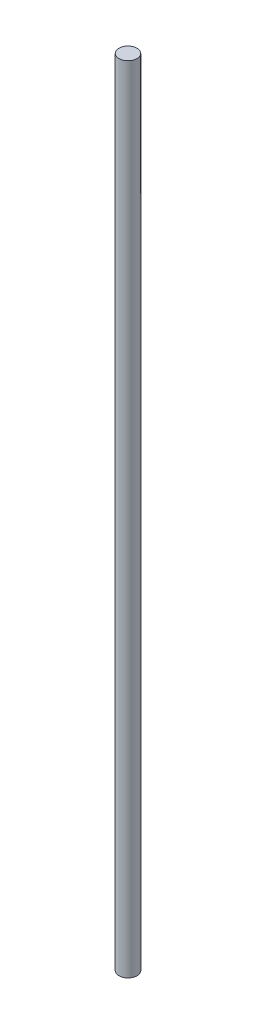
ISO-10303-21;
HEADER;
FILE_DESCRIPTION(('STEP AP214'),'2;1');
FILE_NAME('part.step','',(''),(''),'','','');
FILE_SCHEMA(('AUTOMOTIVE_DESIGN { 1 0 10303 214 1 1 1 1 }'));
ENDSEC;
DATA;
#1=APPLICATION_CONTEXT('core data for automotive mechanical design processes');
#2=APPLICATION_PROTOCOL_DEFINITION('international standard','automotive_design',2000,#1);
#3=PRODUCT_CONTEXT('',#1,'mechanical');
#4=PRODUCT('Part','Part','',(#3));
#5=PRODUCT_RELATED_PRODUCT_CATEGORY('part','',(#4));
#6=PRODUCT_DEFINITION_FORMATION('','',#4);
#7=PRODUCT_DEFINITION_CONTEXT('part definition',#1,'design');
#8=PRODUCT_DEFINITION('design','',#6,#7);
#9=PRODUCT_DEFINITION_SHAPE('','',#8);
#10=(LENGTH_UNIT() NAMED_UNIT(*) SI_UNIT(.MILLI.,.METRE.));
#11=(NAMED_UNIT(*) PLANE_ANGLE_UNIT() SI_UNIT($,.RADIAN.));
#12=(NAMED_UNIT(*) SI_UNIT($,.STERADIAN.) SOLID_ANGLE_UNIT());
#13=UNCERTAINTY_MEASURE_WITH_UNIT(LENGTH_MEASURE(1.E-05),#10,'distance_accuracy_value','');
#14=(GEOMETRIC_REPRESENTATION_CONTEXT(3) GLOBAL_UNCERTAINTY_ASSIGNED_CONTEXT((#13)) GLOBAL_UNIT_ASSIGNED_CONTEXT((#10,
#11,#12)) REPRESENTATION_CONTEXT('',''));
#15=CARTESIAN_POINT('',(0.,0.,0.));
#16=DIRECTION('',(0.,0.,1.));
#17=DIRECTION('',(1.,0.,0.));
#18=AXIS2_PLACEMENT_3D('',#15,#16,#17);
#19=CARTESIAN_POINT('',(0.,220.,0.));
#20=DIRECTION('',(0.,-1.,0.));
#21=DIRECTION('',(0.,0.,-1.));
#22=AXIS2_PLACEMENT_3D('',#19,#20,#21);
#23=CYLINDRICAL_SURFACE('',#22,2.5);
#24=CARTESIAN_POINT('',(0.,220.,0.));
#25=DIRECTION('',(0.,1.,0.));
#26=DIRECTION('',(0.,0.,1.));
#27=AXIS2_PLACEMENT_3D('',#24,#25,#26);
#28=CIRCLE('',#27,2.5);
#29=CARTESIAN_POINT('',(0.,220.,2.5));
#30=VERTEX_POINT('',#29);
#31=EDGE_CURVE('E10',#30,#30,#28,.T.);
#32=ORIENTED_EDGE('',*,*,#31,.F.);
#33=EDGE_LOOP('',(#32));
#34=FACE_BOUND('',#33,.T.);
#35=CARTESIAN_POINT('',(0.,0.,0.));
#36=DIRECTION('',(0.,1.,0.));
#37=DIRECTION('',(0.,0.,1.));
#38=AXIS2_PLACEMENT_3D('',#35,#36,#37);
#39=CIRCLE('',#38,2.5);
#40=CARTESIAN_POINT('',(0.,0.,2.5));
#41=VERTEX_POINT('',#40);
#42=EDGE_CURVE('E38',#41,#41,#39,.T.);
#43=ORIENTED_EDGE('',*,*,#42,.T.);
#44=EDGE_LOOP('',(#43));
#45=FACE_BOUND('',#44,.T.);
#46=ADVANCED_FACE('F35',(#34,#45),#23,.T.);
#47=CARTESIAN_POINT('',(0.,220.,0.));
#48=DIRECTION('',(0.,1.,0.));
#49=DIRECTION('',(0.,0.,1.));
#50=AXIS2_PLACEMENT_3D('',#47,#48,#49);
#51=PLANE('',#50);
#52=ORIENTED_EDGE('',*,*,#31,.T.);
#53=EDGE_LOOP('',(#52));
#54=FACE_BOUND('',#53,.T.);
#55=ADVANCED_FACE('F50',(#54),#51,.T.);
#56=CARTESIAN_POINT('',(0.,0.,0.));
#57=DIRECTION('',(0.,1.,0.));
#58=DIRECTION('',(0.,0.,1.));
#59=AXIS2_PLACEMENT_3D('',#56,#57,#58);
#60=PLANE('',#59);
#61=ORIENTED_EDGE('',*,*,#42,.F.);
#62=EDGE_LOOP('',(#61));
#63=FACE_BOUND('',#62,.T.);
#64=ADVANCED_FACE('F48',(#63),#60,.F.);
#65=CLOSED_SHELL('',(#46,#55,#64));
#66=MANIFOLD_SOLID_BREP('B2',#65);
#67=ADVANCED_BREP_SHAPE_REPRESENTATION('',(#18,#66),#14);
#68=SHAPE_DEFINITION_REPRESENTATION(#9,#67);
ENDSEC;
END-ISO-10303-21;
